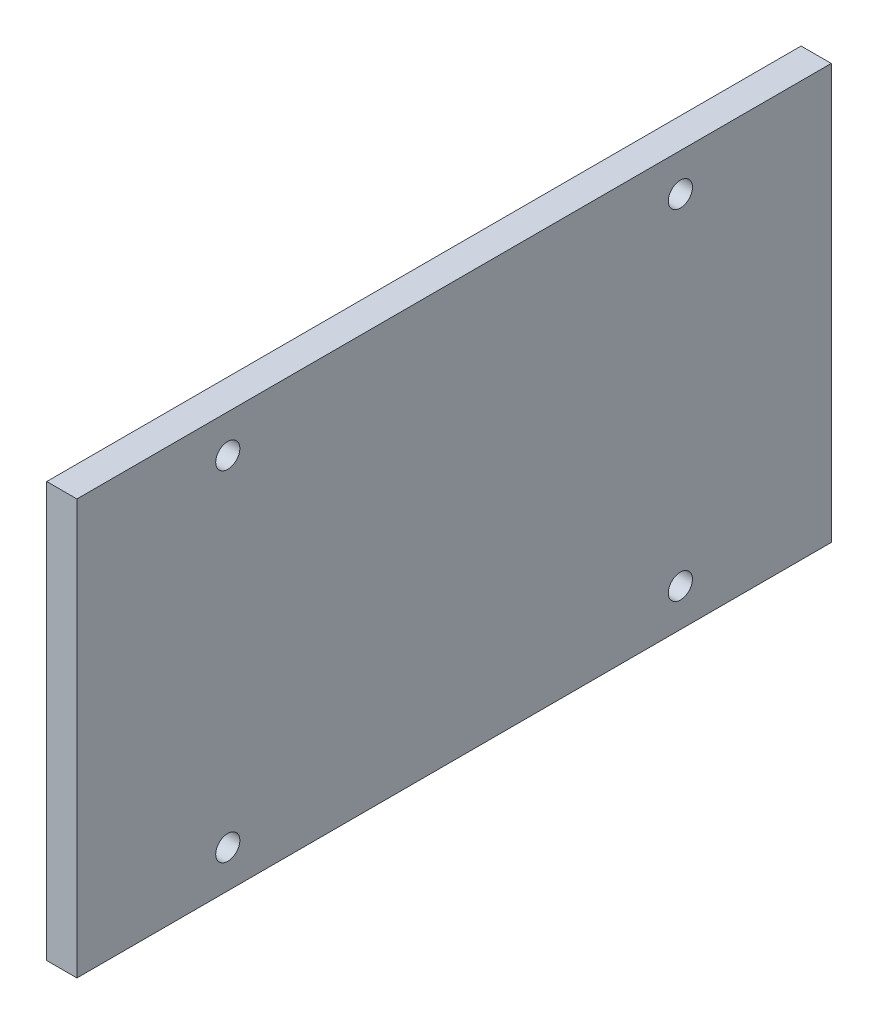
ISO-10303-21;
HEADER;
FILE_DESCRIPTION(('STEP AP214'),'2;1');
FILE_NAME('part.step','',(''),(''),'','','');
FILE_SCHEMA(('AUTOMOTIVE_DESIGN { 1 0 10303 214 1 1 1 1 }'));
ENDSEC;
DATA;
#1=APPLICATION_CONTEXT('core data for automotive mechanical design processes');
#2=APPLICATION_PROTOCOL_DEFINITION('international standard','automotive_design',2000,#1);
#3=PRODUCT_CONTEXT('',#1,'mechanical');
#4=PRODUCT('Part','Part','',(#3));
#5=PRODUCT_RELATED_PRODUCT_CATEGORY('part','',(#4));
#6=PRODUCT_DEFINITION_FORMATION('','',#4);
#7=PRODUCT_DEFINITION_CONTEXT('part definition',#1,'design');
#8=PRODUCT_DEFINITION('design','',#6,#7);
#9=PRODUCT_DEFINITION_SHAPE('','',#8);
#10=(LENGTH_UNIT() NAMED_UNIT(*) SI_UNIT(.MILLI.,.METRE.));
#11=(NAMED_UNIT(*) PLANE_ANGLE_UNIT() SI_UNIT($,.RADIAN.));
#12=(NAMED_UNIT(*) SI_UNIT($,.STERADIAN.) SOLID_ANGLE_UNIT());
#13=UNCERTAINTY_MEASURE_WITH_UNIT(LENGTH_MEASURE(1.E-05),#10,'distance_accuracy_value','');
#14=(GEOMETRIC_REPRESENTATION_CONTEXT(3) GLOBAL_UNCERTAINTY_ASSIGNED_CONTEXT((#13)) GLOBAL_UNIT_ASSIGNED_CONTEXT((#10,
#11,#12)) REPRESENTATION_CONTEXT('',''));
#15=CARTESIAN_POINT('',(0.,0.,0.));
#16=DIRECTION('',(0.,0.,1.));
#17=DIRECTION('',(1.,0.,0.));
#18=AXIS2_PLACEMENT_3D('',#15,#16,#17);
#19=CARTESIAN_POINT('',(-50.,-60.,50.));
#20=DIRECTION('',(0.,0.,-1.));
#21=DIRECTION('',(-1.,0.,0.));
#22=AXIS2_PLACEMENT_3D('',#19,#20,#21);
#23=PLANE('',#22);
#24=DIRECTION('',(-1.,0.,0.));
#25=VECTOR('',#24,1.);
#26=CARTESIAN_POINT('',(-50.,-5.,50.));
#27=LINE('',#26,#25);
#28=CARTESIAN_POINT('',(-50.,-5.,50.));
#29=VERTEX_POINT('',#28);
#30=CARTESIAN_POINT('',(-54.,-5.,50.));
#31=VERTEX_POINT('',#30);
#32=EDGE_CURVE('E99',#29,#31,#27,.T.);
#33=ORIENTED_EDGE('',*,*,#32,.T.);
#34=DIRECTION('',(0.,1.,0.));
#35=VECTOR('',#34,1.);
#36=CARTESIAN_POINT('',(-54.,-60.,50.));
#37=LINE('',#36,#35);
#38=CARTESIAN_POINT('',(-54.,-60.,50.));
#39=VERTEX_POINT('',#38);
#40=EDGE_CURVE('E11',#39,#31,#37,.T.);
#41=ORIENTED_EDGE('',*,*,#40,.F.);
#42=DIRECTION('',(-1.,0.,0.));
#43=VECTOR('',#42,1.);
#44=CARTESIAN_POINT('',(-50.,-60.,50.));
#45=LINE('',#44,#43);
#46=CARTESIAN_POINT('',(-50.,-60.,50.));
#47=VERTEX_POINT('',#46);
#48=EDGE_CURVE('E87',#47,#39,#45,.T.);
#49=ORIENTED_EDGE('',*,*,#48,.F.);
#50=DIRECTION('',(0.,1.,0.));
#51=VECTOR('',#50,1.);
#52=CARTESIAN_POINT('',(-50.,-60.,50.));
#53=LINE('',#52,#51);
#54=EDGE_CURVE('E95',#47,#29,#53,.T.);
#55=ORIENTED_EDGE('',*,*,#54,.T.);
#56=EDGE_LOOP('',(#33,#41,#49,#55));
#57=FACE_BOUND('',#56,.T.);
#58=ADVANCED_FACE('F36',(#57),#23,.F.);
#59=CARTESIAN_POINT('',(-54.,-60.,-50.));
#60=DIRECTION('',(1.,0.,0.));
#61=DIRECTION('',(0.,0.,-1.));
#62=AXIS2_PLACEMENT_3D('',#59,#60,#61);
#63=PLANE('',#62);
#64=CARTESIAN_POINT('',(-54.,-55.,-30.));
#65=DIRECTION('',(-1.,0.,0.));
#66=DIRECTION('',(0.,0.,-1.));
#67=AXIS2_PLACEMENT_3D('',#64,#65,#66);
#68=CIRCLE('',#67,1.6);
#69=CARTESIAN_POINT('',(-54.,-55.,-31.6));
#70=VERTEX_POINT('',#69);
#71=EDGE_CURVE('E123',#70,#70,#68,.T.);
#72=ORIENTED_EDGE('',*,*,#71,.F.);
#73=EDGE_LOOP('',(#72));
#74=FACE_BOUND('',#73,.T.);
#75=CARTESIAN_POINT('',(-54.,-55.,30.));
#76=DIRECTION('',(-1.,0.,0.));
#77=DIRECTION('',(0.,0.,-1.));
#78=AXIS2_PLACEMENT_3D('',#75,#76,#77);
#79=CIRCLE('',#78,1.6);
#80=CARTESIAN_POINT('',(-54.,-55.,28.4));
#81=VERTEX_POINT('',#80);
#82=EDGE_CURVE('E122',#81,#81,#79,.T.);
#83=ORIENTED_EDGE('',*,*,#82,.F.);
#84=EDGE_LOOP('',(#83));
#85=FACE_BOUND('',#84,.T.);
#86=CARTESIAN_POINT('',(-54.,-10.,30.));
#87=DIRECTION('',(-1.,0.,0.));
#88=DIRECTION('',(0.,0.,1.));
#89=AXIS2_PLACEMENT_3D('',#86,#87,#88);
#90=CIRCLE('',#89,1.6);
#91=CARTESIAN_POINT('',(-54.,-10.,31.6));
#92=VERTEX_POINT('',#91);
#93=EDGE_CURVE('E129',#92,#92,#90,.T.);
#94=ORIENTED_EDGE('',*,*,#93,.F.);
#95=EDGE_LOOP('',(#94));
#96=FACE_BOUND('',#95,.T.);
#97=CARTESIAN_POINT('',(-54.,-10.,-30.));
#98=DIRECTION('',(-1.,0.,0.));
#99=DIRECTION('',(0.,0.,1.));
#100=AXIS2_PLACEMENT_3D('',#97,#98,#99);
#101=CIRCLE('',#100,1.6);
#102=CARTESIAN_POINT('',(-54.,-10.,-28.4));
#103=VERTEX_POINT('',#102);
#104=EDGE_CURVE('E115',#103,#103,#101,.T.);
#105=ORIENTED_EDGE('',*,*,#104,.F.);
#106=EDGE_LOOP('',(#105));
#107=FACE_BOUND('',#106,.T.);
#108=DIRECTION('',(0.,0.,-1.));
#109=VECTOR('',#108,1.);
#110=CARTESIAN_POINT('',(-54.,-5.,-50.));
#111=LINE('',#110,#109);
#112=CARTESIAN_POINT('',(-54.,-5.,-50.));
#113=VERTEX_POINT('',#112);
#114=EDGE_CURVE('E91',#31,#113,#111,.T.);
#115=ORIENTED_EDGE('',*,*,#114,.T.);
#116=DIRECTION('',(0.,1.,0.));
#117=VECTOR('',#116,1.);
#118=CARTESIAN_POINT('',(-54.,-60.,-50.));
#119=LINE('',#118,#117);
#120=CARTESIAN_POINT('',(-54.,-60.,-50.));
#121=VERTEX_POINT('',#120);
#122=EDGE_CURVE('E44',#121,#113,#119,.T.);
#123=ORIENTED_EDGE('',*,*,#122,.F.);
#124=DIRECTION('',(0.,0.,-1.));
#125=VECTOR('',#124,1.);
#126=CARTESIAN_POINT('',(-54.,-60.,-50.));
#127=LINE('',#126,#125);
#128=EDGE_CURVE('E82',#39,#121,#127,.T.);
#129=ORIENTED_EDGE('',*,*,#128,.F.);
#130=ORIENTED_EDGE('',*,*,#40,.T.);
#131=EDGE_LOOP('',(#115,#123,#129,#130));
#132=FACE_BOUND('',#131,.T.);
#133=ADVANCED_FACE('F90',(#74,#85,#96,#107,#132),#63,.F.);
#134=CARTESIAN_POINT('',(-50.,-60.,-50.));
#135=DIRECTION('',(0.,0.,1.));
#136=DIRECTION('',(1.,0.,0.));
#137=AXIS2_PLACEMENT_3D('',#134,#135,#136);
#138=PLANE('',#137);
#139=DIRECTION('',(1.,0.,0.));
#140=VECTOR('',#139,1.);
#141=CARTESIAN_POINT('',(-50.,-5.,-50.));
#142=LINE('',#141,#140);
#143=CARTESIAN_POINT('',(-50.,-5.,-50.));
#144=VERTEX_POINT('',#143);
#145=EDGE_CURVE('E69',#113,#144,#142,.T.);
#146=ORIENTED_EDGE('',*,*,#145,.T.);
#147=DIRECTION('',(0.,1.,0.));
#148=VECTOR('',#147,1.);
#149=CARTESIAN_POINT('',(-50.,-60.,-50.));
#150=LINE('',#149,#148);
#151=CARTESIAN_POINT('',(-50.,-60.,-50.));
#152=VERTEX_POINT('',#151);
#153=EDGE_CURVE('E92',#152,#144,#150,.T.);
#154=ORIENTED_EDGE('',*,*,#153,.F.);
#155=DIRECTION('',(1.,0.,0.));
#156=VECTOR('',#155,1.);
#157=CARTESIAN_POINT('',(-50.,-60.,-50.));
#158=LINE('',#157,#156);
#159=EDGE_CURVE('E85',#121,#152,#158,.T.);
#160=ORIENTED_EDGE('',*,*,#159,.F.);
#161=ORIENTED_EDGE('',*,*,#122,.T.);
#162=EDGE_LOOP('',(#146,#154,#160,#161));
#163=FACE_BOUND('',#162,.T.);
#164=ADVANCED_FACE('F93',(#163),#138,.F.);
#165=CARTESIAN_POINT('',(-50.,-60.,-50.));
#166=DIRECTION('',(-1.,0.,0.));
#167=DIRECTION('',(0.,0.,1.));
#168=AXIS2_PLACEMENT_3D('',#165,#166,#167);
#169=PLANE('',#168);
#170=CARTESIAN_POINT('',(-50.,-55.,-30.));
#171=DIRECTION('',(-1.,0.,0.));
#172=DIRECTION('',(0.,0.,1.));
#173=AXIS2_PLACEMENT_3D('',#170,#171,#172);
#174=CIRCLE('',#173,1.6);
#175=CARTESIAN_POINT('',(-50.,-55.,-28.4));
#176=VERTEX_POINT('',#175);
#177=EDGE_CURVE('E119',#176,#176,#174,.F.);
#178=ORIENTED_EDGE('',*,*,#177,.F.);
#179=EDGE_LOOP('',(#178));
#180=FACE_BOUND('',#179,.T.);
#181=CARTESIAN_POINT('',(-50.,-55.,30.));
#182=DIRECTION('',(-1.,0.,0.));
#183=DIRECTION('',(0.,0.,1.));
#184=AXIS2_PLACEMENT_3D('',#181,#182,#183);
#185=CIRCLE('',#184,1.6);
#186=CARTESIAN_POINT('',(-50.,-55.,31.6));
#187=VERTEX_POINT('',#186);
#188=EDGE_CURVE('E126',#187,#187,#185,.F.);
#189=ORIENTED_EDGE('',*,*,#188,.F.);
#190=EDGE_LOOP('',(#189));
#191=FACE_BOUND('',#190,.T.);
#192=CARTESIAN_POINT('',(-50.,-10.,30.));
#193=DIRECTION('',(-1.,0.,0.));
#194=DIRECTION('',(0.,0.,1.));
#195=AXIS2_PLACEMENT_3D('',#192,#193,#194);
#196=CIRCLE('',#195,1.6);
#197=CARTESIAN_POINT('',(-50.,-10.,31.6));
#198=VERTEX_POINT('',#197);
#199=EDGE_CURVE('E118',#198,#198,#196,.F.);
#200=ORIENTED_EDGE('',*,*,#199,.F.);
#201=EDGE_LOOP('',(#200));
#202=FACE_BOUND('',#201,.T.);
#203=CARTESIAN_POINT('',(-50.,-10.,-30.));
#204=DIRECTION('',(-1.,0.,0.));
#205=DIRECTION('',(0.,0.,1.));
#206=AXIS2_PLACEMENT_3D('',#203,#204,#205);
#207=CIRCLE('',#206,1.6);
#208=CARTESIAN_POINT('',(-50.,-10.,-28.4));
#209=VERTEX_POINT('',#208);
#210=EDGE_CURVE('E102',#209,#209,#207,.F.);
#211=ORIENTED_EDGE('',*,*,#210,.F.);
#212=EDGE_LOOP('',(#211));
#213=FACE_BOUND('',#212,.T.);
#214=DIRECTION('',(0.,0.,1.));
#215=VECTOR('',#214,1.);
#216=CARTESIAN_POINT('',(-50.,-5.,-50.));
#217=LINE('',#216,#215);
#218=EDGE_CURVE('E75',#144,#29,#217,.T.);
#219=ORIENTED_EDGE('',*,*,#218,.T.);
#220=ORIENTED_EDGE('',*,*,#54,.F.);
#221=DIRECTION('',(0.,0.,1.));
#222=VECTOR('',#221,1.);
#223=CARTESIAN_POINT('',(-50.,-60.,-50.));
#224=LINE('',#223,#222);
#225=EDGE_CURVE('E52',#152,#47,#224,.T.);
#226=ORIENTED_EDGE('',*,*,#225,.F.);
#227=ORIENTED_EDGE('',*,*,#153,.T.);
#228=EDGE_LOOP('',(#219,#220,#226,#227));
#229=FACE_BOUND('',#228,.T.);
#230=ADVANCED_FACE('F107',(#180,#191,#202,#213,#229),#169,.F.);
#231=CARTESIAN_POINT('',(0.,-60.,0.));
#232=DIRECTION('',(0.,1.,0.));
#233=DIRECTION('',(0.,0.,1.));
#234=AXIS2_PLACEMENT_3D('',#231,#232,#233);
#235=PLANE('',#234);
#236=ORIENTED_EDGE('',*,*,#48,.T.);
#237=ORIENTED_EDGE('',*,*,#128,.T.);
#238=ORIENTED_EDGE('',*,*,#159,.T.);
#239=ORIENTED_EDGE('',*,*,#225,.T.);
#240=EDGE_LOOP('',(#236,#237,#238,#239));
#241=FACE_BOUND('',#240,.T.);
#242=ADVANCED_FACE('F83',(#241),#235,.F.);
#243=CARTESIAN_POINT('',(0.,-5.,0.));
#244=DIRECTION('',(0.,1.,0.));
#245=DIRECTION('',(0.,0.,1.));
#246=AXIS2_PLACEMENT_3D('',#243,#244,#245);
#247=PLANE('',#246);
#248=ORIENTED_EDGE('',*,*,#32,.F.);
#249=ORIENTED_EDGE('',*,*,#218,.F.);
#250=ORIENTED_EDGE('',*,*,#145,.F.);
#251=ORIENTED_EDGE('',*,*,#114,.F.);
#252=EDGE_LOOP('',(#248,#249,#250,#251));
#253=FACE_BOUND('',#252,.T.);
#254=ADVANCED_FACE('F110',(#253),#247,.T.);
#255=CARTESIAN_POINT('',(355.025641695905,-10.,-30.));
#256=DIRECTION('',(-1.,0.,0.));
#257=DIRECTION('',(0.,0.,1.));
#258=AXIS2_PLACEMENT_3D('',#255,#256,#257);
#259=CYLINDRICAL_SURFACE('',#258,1.6);
#260=ORIENTED_EDGE('',*,*,#104,.T.);
#261=EDGE_LOOP('',(#260));
#262=FACE_BOUND('',#261,.T.);
#263=ORIENTED_EDGE('',*,*,#210,.T.);
#264=EDGE_LOOP('',(#263));
#265=FACE_BOUND('',#264,.T.);
#266=ADVANCED_FACE('F145',(#262,#265),#259,.F.);
#267=CARTESIAN_POINT('',(355.025641695905,-10.,30.));
#268=DIRECTION('',(-1.,0.,0.));
#269=DIRECTION('',(0.,0.,1.));
#270=AXIS2_PLACEMENT_3D('',#267,#268,#269);
#271=CYLINDRICAL_SURFACE('',#270,1.6);
#272=ORIENTED_EDGE('',*,*,#93,.T.);
#273=EDGE_LOOP('',(#272));
#274=FACE_BOUND('',#273,.T.);
#275=ORIENTED_EDGE('',*,*,#199,.T.);
#276=EDGE_LOOP('',(#275));
#277=FACE_BOUND('',#276,.T.);
#278=ADVANCED_FACE('F137',(#274,#277),#271,.F.);
#279=CARTESIAN_POINT('',(355.025641695905,-55.,30.));
#280=DIRECTION('',(-1.,0.,0.));
#281=DIRECTION('',(0.,0.,1.));
#282=AXIS2_PLACEMENT_3D('',#279,#280,#281);
#283=CYLINDRICAL_SURFACE('',#282,1.6);
#284=ORIENTED_EDGE('',*,*,#82,.T.);
#285=EDGE_LOOP('',(#284));
#286=FACE_BOUND('',#285,.T.);
#287=ORIENTED_EDGE('',*,*,#188,.T.);
#288=EDGE_LOOP('',(#287));
#289=FACE_BOUND('',#288,.T.);
#290=ADVANCED_FACE('F209',(#286,#289),#283,.F.);
#291=CARTESIAN_POINT('',(355.025641695905,-55.,-30.));
#292=DIRECTION('',(-1.,0.,0.));
#293=DIRECTION('',(0.,0.,1.));
#294=AXIS2_PLACEMENT_3D('',#291,#292,#293);
#295=CYLINDRICAL_SURFACE('',#294,1.6);
#296=ORIENTED_EDGE('',*,*,#71,.T.);
#297=EDGE_LOOP('',(#296));
#298=FACE_BOUND('',#297,.T.);
#299=ORIENTED_EDGE('',*,*,#177,.T.);
#300=EDGE_LOOP('',(#299));
#301=FACE_BOUND('',#300,.T.);
#302=ADVANCED_FACE('F218',(#298,#301),#295,.F.);
#303=CLOSED_SHELL('',(#58,#133,#164,#230,#242,#254,#266,#278,#290,#302));
#304=MANIFOLD_SOLID_BREP('B2',#303);
#305=ADVANCED_BREP_SHAPE_REPRESENTATION('',(#18,#304),#14);
#306=SHAPE_DEFINITION_REPRESENTATION(#9,#305);
ENDSEC;
END-ISO-10303-21;
